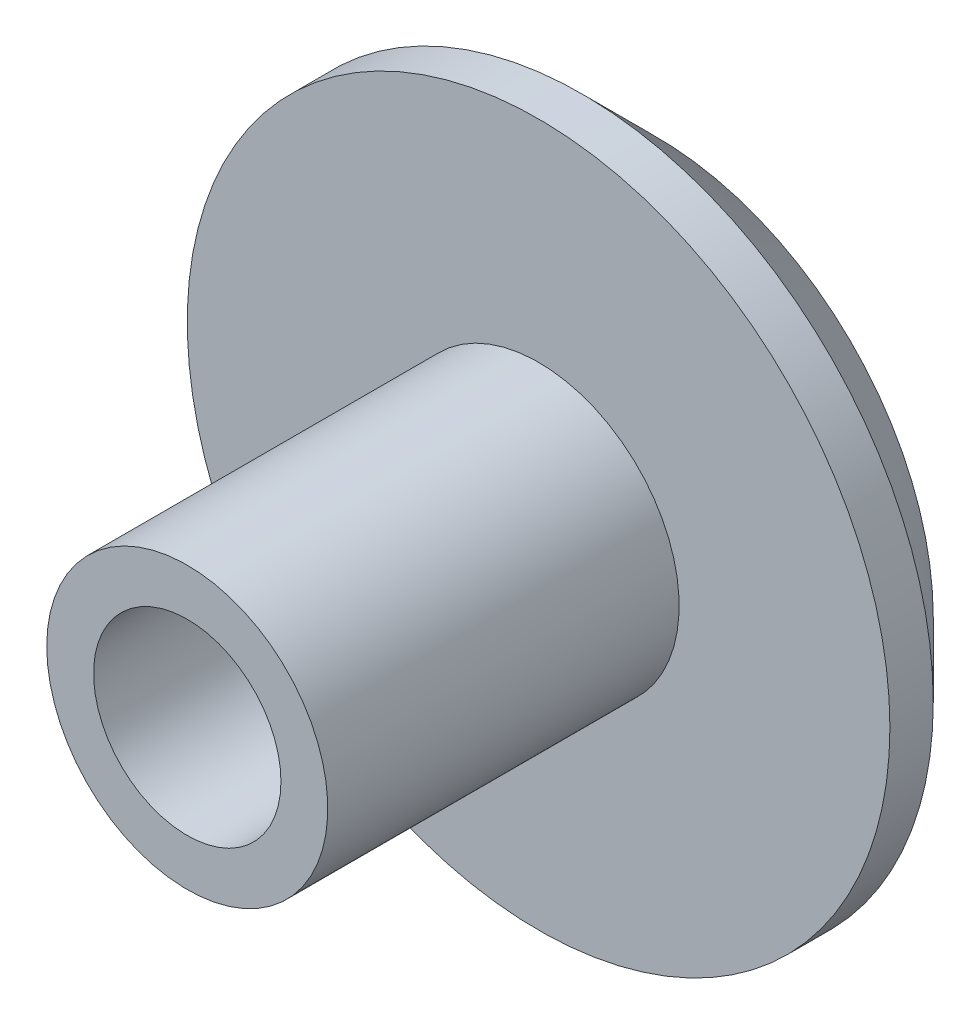
ISO-10303-21;
HEADER;
FILE_DESCRIPTION(('STEP AP214'),'2;1');
FILE_NAME('part.step','',(''),(''),'','','');
FILE_SCHEMA(('AUTOMOTIVE_DESIGN { 1 0 10303 214 1 1 1 1 }'));
ENDSEC;
DATA;
#1=APPLICATION_CONTEXT('core data for automotive mechanical design processes');
#2=APPLICATION_PROTOCOL_DEFINITION('international standard','automotive_design',2000,#1);
#3=PRODUCT_CONTEXT('',#1,'mechanical');
#4=PRODUCT('Part','Part','',(#3));
#5=PRODUCT_RELATED_PRODUCT_CATEGORY('part','',(#4));
#6=PRODUCT_DEFINITION_FORMATION('','',#4);
#7=PRODUCT_DEFINITION_CONTEXT('part definition',#1,'design');
#8=PRODUCT_DEFINITION('design','',#6,#7);
#9=PRODUCT_DEFINITION_SHAPE('','',#8);
#10=(LENGTH_UNIT() NAMED_UNIT(*) SI_UNIT(.MILLI.,.METRE.));
#11=(NAMED_UNIT(*) PLANE_ANGLE_UNIT() SI_UNIT($,.RADIAN.));
#12=(NAMED_UNIT(*) SI_UNIT($,.STERADIAN.) SOLID_ANGLE_UNIT());
#13=UNCERTAINTY_MEASURE_WITH_UNIT(LENGTH_MEASURE(1.E-05),#10,'distance_accuracy_value','');
#14=(GEOMETRIC_REPRESENTATION_CONTEXT(3) GLOBAL_UNCERTAINTY_ASSIGNED_CONTEXT((#13)) GLOBAL_UNIT_ASSIGNED_CONTEXT((#10,
#11,#12)) REPRESENTATION_CONTEXT('',''));
#15=CARTESIAN_POINT('',(0.,0.,0.));
#16=DIRECTION('',(0.,0.,1.));
#17=DIRECTION('',(1.,0.,0.));
#18=AXIS2_PLACEMENT_3D('',#15,#16,#17);
#19=CARTESIAN_POINT('',(0.,0.,1.5875));
#20=DIRECTION('',(0.,0.,-1.));
#21=DIRECTION('',(-1.,0.,0.));
#22=AXIS2_PLACEMENT_3D('',#19,#20,#21);
#23=CYLINDRICAL_SURFACE('',#22,4.7625);
#24=CARTESIAN_POINT('',(0.,0.,0.999999999999999));
#25=DIRECTION('',(0.,0.,1.));
#26=DIRECTION('',(1.,0.,0.));
#27=AXIS2_PLACEMENT_3D('',#24,#25,#26);
#28=CIRCLE('',#27,4.7625);
#29=CARTESIAN_POINT('',(4.7625,0.,0.999999999999999));
#30=VERTEX_POINT('',#29);
#31=EDGE_CURVE('E45',#30,#30,#28,.T.);
#32=ORIENTED_EDGE('',*,*,#31,.T.);
#33=EDGE_LOOP('',(#32));
#34=FACE_BOUND('',#33,.T.);
#35=CARTESIAN_POINT('',(0.,0.,1.5875));
#36=DIRECTION('',(0.,0.,1.));
#37=DIRECTION('',(1.,0.,0.));
#38=AXIS2_PLACEMENT_3D('',#35,#36,#37);
#39=CIRCLE('',#38,4.7625);
#40=CARTESIAN_POINT('',(4.7625,0.,1.5875));
#41=VERTEX_POINT('',#40);
#42=EDGE_CURVE('E53',#41,#41,#39,.T.);
#43=ORIENTED_EDGE('',*,*,#42,.F.);
#44=EDGE_LOOP('',(#43));
#45=FACE_BOUND('',#44,.T.);
#46=ADVANCED_FACE('F37',(#34,#45),#23,.T.);
#47=CARTESIAN_POINT('',(0.,0.,1.5875));
#48=DIRECTION('',(0.,0.,1.));
#49=DIRECTION('',(1.,0.,0.));
#50=AXIS2_PLACEMENT_3D('',#47,#48,#49);
#51=PLANE('',#50);
#52=CARTESIAN_POINT('',(0.,0.,1.5875));
#53=DIRECTION('',(0.,0.,1.));
#54=DIRECTION('',(1.,0.,0.));
#55=AXIS2_PLACEMENT_3D('',#52,#53,#54);
#56=CIRCLE('',#55,1.905);
#57=CARTESIAN_POINT('',(-1.905,0.,1.5875));
#58=VERTEX_POINT('',#57);
#59=EDGE_CURVE('E49',#58,#58,#56,.T.);
#60=ORIENTED_EDGE('',*,*,#59,.F.);
#61=EDGE_LOOP('',(#60));
#62=FACE_BOUND('',#61,.T.);
#63=ORIENTED_EDGE('',*,*,#42,.T.);
#64=EDGE_LOOP('',(#63));
#65=FACE_BOUND('',#64,.T.);
#66=ADVANCED_FACE('F88',(#62,#65),#51,.T.);
#67=CARTESIAN_POINT('',(0.,0.,0.));
#68=DIRECTION('',(0.,0.,1.));
#69=DIRECTION('',(1.,0.,0.));
#70=AXIS2_PLACEMENT_3D('',#67,#68,#69);
#71=PLANE('',#70);
#72=CARTESIAN_POINT('',(0.,0.,0.));
#73=DIRECTION('',(0.,0.,1.));
#74=DIRECTION('',(1.,0.,0.));
#75=AXIS2_PLACEMENT_3D('',#72,#73,#74);
#76=CIRCLE('',#75,3.7625);
#77=CARTESIAN_POINT('',(3.7625,0.,0.));
#78=VERTEX_POINT('',#77);
#79=EDGE_CURVE('E10',#78,#78,#76,.F.);
#80=ORIENTED_EDGE('',*,*,#79,.T.);
#81=EDGE_LOOP('',(#80));
#82=FACE_BOUND('',#81,.T.);
#83=CARTESIAN_POINT('',(0.,0.,0.));
#84=DIRECTION('',(0.,0.,1.));
#85=DIRECTION('',(1.,0.,0.));
#86=AXIS2_PLACEMENT_3D('',#83,#84,#85);
#87=CIRCLE('',#86,1.27);
#88=CARTESIAN_POINT('',(1.27,0.,0.));
#89=VERTEX_POINT('',#88);
#90=EDGE_CURVE('E61',#89,#89,#87,.T.);
#91=ORIENTED_EDGE('',*,*,#90,.T.);
#92=EDGE_LOOP('',(#91));
#93=FACE_BOUND('',#92,.T.);
#94=ADVANCED_FACE('F68',(#82,#93),#71,.F.);
#95=CARTESIAN_POINT('',(0.,0.,6.35));
#96=DIRECTION('',(0.,0.,-1.));
#97=DIRECTION('',(-1.,0.,0.));
#98=AXIS2_PLACEMENT_3D('',#95,#96,#97);
#99=CYLINDRICAL_SURFACE('',#98,1.905);
#100=CARTESIAN_POINT('',(0.,0.,6.35));
#101=DIRECTION('',(0.,0.,1.));
#102=DIRECTION('',(1.,0.,0.));
#103=AXIS2_PLACEMENT_3D('',#100,#101,#102);
#104=CIRCLE('',#103,1.905);
#105=CARTESIAN_POINT('',(-1.905,0.,6.35));
#106=VERTEX_POINT('',#105);
#107=EDGE_CURVE('E57',#106,#106,#104,.T.);
#108=CARTESIAN_POINT('',(-1.905,0.,6.35));
#109=CARTESIAN_POINT('',(-1.905,0.,6.300390625));
#110=CARTESIAN_POINT('',(-1.905,0.,6.25078125));
#111=CARTESIAN_POINT('',(-1.905,0.,6.1515625));
#112=CARTESIAN_POINT('',(-1.905,0.,6.101953125));
#113=CARTESIAN_POINT('',(-1.905,0.,6.002734375));
#114=CARTESIAN_POINT('',(-1.905,0.,5.953125));
#115=CARTESIAN_POINT('',(-1.905,0.,5.85390625));
#116=CARTESIAN_POINT('',(-1.905,0.,5.804296875));
#117=CARTESIAN_POINT('',(-1.905,0.,5.705078125));
#118=CARTESIAN_POINT('',(-1.905,0.,5.65546875));
#119=CARTESIAN_POINT('',(-1.905,0.,5.55625));
#120=CARTESIAN_POINT('',(-1.905,0.,5.506640625));
#121=CARTESIAN_POINT('',(-1.905,0.,5.407421875));
#122=CARTESIAN_POINT('',(-1.905,0.,5.3578125));
#123=CARTESIAN_POINT('',(-1.905,0.,5.25859375));
#124=CARTESIAN_POINT('',(-1.905,0.,5.208984375));
#125=CARTESIAN_POINT('',(-1.905,0.,5.109765625));
#126=CARTESIAN_POINT('',(-1.905,0.,5.06015625));
#127=CARTESIAN_POINT('',(-1.905,0.,4.9609375));
#128=CARTESIAN_POINT('',(-1.905,0.,4.911328125));
#129=CARTESIAN_POINT('',(-1.905,0.,4.812109375));
#130=CARTESIAN_POINT('',(-1.905,0.,4.7625));
#131=CARTESIAN_POINT('',(-1.905,0.,4.66328125));
#132=CARTESIAN_POINT('',(-1.905,0.,4.613671875));
#133=CARTESIAN_POINT('',(-1.905,0.,4.514453125));
#134=CARTESIAN_POINT('',(-1.905,0.,4.46484375));
#135=CARTESIAN_POINT('',(-1.905,0.,4.365625));
#136=CARTESIAN_POINT('',(-1.905,0.,4.316015625));
#137=CARTESIAN_POINT('',(-1.905,0.,4.216796875));
#138=CARTESIAN_POINT('',(-1.905,0.,4.1671875));
#139=CARTESIAN_POINT('',(-1.905,0.,4.06796875));
#140=CARTESIAN_POINT('',(-1.905,0.,4.018359375));
#141=CARTESIAN_POINT('',(-1.905,0.,3.919140625));
#142=CARTESIAN_POINT('',(-1.905,0.,3.86953125));
#143=CARTESIAN_POINT('',(-1.905,0.,3.7703125));
#144=CARTESIAN_POINT('',(-1.905,0.,3.720703125));
#145=CARTESIAN_POINT('',(-1.905,0.,3.621484375));
#146=CARTESIAN_POINT('',(-1.905,0.,3.571875));
#147=CARTESIAN_POINT('',(-1.905,0.,3.47265625));
#148=CARTESIAN_POINT('',(-1.905,0.,3.423046875));
#149=CARTESIAN_POINT('',(-1.905,0.,3.323828125));
#150=CARTESIAN_POINT('',(-1.905,0.,3.27421875));
#151=CARTESIAN_POINT('',(-1.905,0.,3.175));
#152=CARTESIAN_POINT('',(-1.905,0.,3.125390625));
#153=CARTESIAN_POINT('',(-1.905,0.,3.026171875));
#154=CARTESIAN_POINT('',(-1.905,0.,2.9765625));
#155=CARTESIAN_POINT('',(-1.905,0.,2.87734375));
#156=CARTESIAN_POINT('',(-1.905,0.,2.827734375));
#157=CARTESIAN_POINT('',(-1.905,0.,2.728515625));
#158=CARTESIAN_POINT('',(-1.905,0.,2.67890625));
#159=CARTESIAN_POINT('',(-1.905,0.,2.5796875));
#160=CARTESIAN_POINT('',(-1.905,0.,2.530078125));
#161=CARTESIAN_POINT('',(-1.905,0.,2.430859375));
#162=CARTESIAN_POINT('',(-1.905,0.,2.38125));
#163=CARTESIAN_POINT('',(-1.905,0.,2.28203125));
#164=CARTESIAN_POINT('',(-1.905,0.,2.232421875));
#165=CARTESIAN_POINT('',(-1.905,0.,2.133203125));
#166=CARTESIAN_POINT('',(-1.905,0.,2.08359375));
#167=CARTESIAN_POINT('',(-1.905,0.,1.984375));
#168=CARTESIAN_POINT('',(-1.905,0.,1.934765625));
#169=CARTESIAN_POINT('',(-1.905,0.,1.835546875));
#170=CARTESIAN_POINT('',(-1.905,0.,1.7859375));
#171=CARTESIAN_POINT('',(-1.905,0.,1.68671875));
#172=CARTESIAN_POINT('',(-1.905,0.,1.637109375));
#173=CARTESIAN_POINT('',(-1.905,0.,1.5875));
#174=B_SPLINE_CURVE_WITH_KNOTS('',3,(#108,#109,#110,#111,#112,#113,#114,#115,#116,#117,#118,
#119,#120,#121,#122,#123,#124,#125,#126,#127,#128,#129,#130,#131,#132,#133,#134,#135,#136,#137,
#138,#139,#140,#141,#142,#143,#144,#145,#146,#147,#148,#149,#150,#151,#152,#153,#154,#155,#156,
#157,#158,#159,#160,#161,#162,#163,#164,#165,#166,#167,#168,#169,#170,#171,#172,#173),
.UNSPECIFIED.,.F.,.F.,(4,2,2,2,2,2,2,2,2,2,2,2,2,2,2,2,2,2,2,2,2,2,2,2,2,2,2,2,2,2,2,2,4),(0.,
0.148828124999999,0.297656249999999,0.446484374999999,0.595312499999999,0.744140625,0.89296875,
1.041796875,1.190625,1.339453125,1.48828125,1.637109375,1.7859375,1.934765625,2.08359375,
2.232421875,2.38125,2.530078125,2.67890625,2.827734375,2.9765625,3.125390625,3.27421875,
3.423046875,3.571875,3.720703125,3.86953125,4.018359375,4.1671875,4.316015625,4.46484375,
4.613671875,4.7625),.UNSPECIFIED.);
#175=EDGE_CURVE('BSEAM79',#106,#58,#174,.T.);
#176=ORIENTED_EDGE('',*,*,#107,.F.);
#177=ORIENTED_EDGE('',*,*,#59,.T.);
#178=ORIENTED_EDGE('',*,*,#175,.T.);
#179=ORIENTED_EDGE('',*,*,#175,.F.);
#180=EDGE_LOOP('',(#176,#178,#177,#179));
#181=FACE_BOUND('',#180,.T.);
#182=ADVANCED_FACE('F79',(#181),#99,.T.);
#183=CARTESIAN_POINT('',(0.,0.,6.35));
#184=DIRECTION('',(0.,0.,1.));
#185=DIRECTION('',(1.,0.,0.));
#186=AXIS2_PLACEMENT_3D('',#183,#184,#185);
#187=PLANE('',#186);
#188=CARTESIAN_POINT('',(0.,0.,6.35));
#189=DIRECTION('',(0.,0.,1.));
#190=DIRECTION('',(1.,0.,0.));
#191=AXIS2_PLACEMENT_3D('',#188,#189,#190);
#192=CIRCLE('',#191,1.27);
#193=CARTESIAN_POINT('',(1.27,0.,6.35));
#194=VERTEX_POINT('',#193);
#195=EDGE_CURVE('E62',#194,#194,#192,.T.);
#196=ORIENTED_EDGE('',*,*,#195,.F.);
#197=EDGE_LOOP('',(#196));
#198=FACE_BOUND('',#197,.T.);
#199=ORIENTED_EDGE('',*,*,#107,.T.);
#200=EDGE_LOOP('',(#199));
#201=FACE_BOUND('',#200,.T.);
#202=ADVANCED_FACE('F73',(#198,#201),#187,.T.);
#203=CARTESIAN_POINT('',(0.,0.,0.));
#204=DIRECTION('',(0.,0.,1.));
#205=DIRECTION('',(1.,0.,0.));
#206=AXIS2_PLACEMENT_3D('',#203,#204,#205);
#207=CYLINDRICAL_SURFACE('',#206,1.27);
#208=ORIENTED_EDGE('',*,*,#90,.F.);
#209=EDGE_LOOP('',(#208));
#210=FACE_BOUND('',#209,.T.);
#211=ORIENTED_EDGE('',*,*,#195,.T.);
#212=EDGE_LOOP('',(#211));
#213=FACE_BOUND('',#212,.T.);
#214=ADVANCED_FACE('F70',(#210,#213),#207,.F.);
#215=CARTESIAN_POINT('',(0.,0.,0.999999999999999));
#216=DIRECTION('',(0.,0.,1.));
#217=DIRECTION('',(1.,0.,0.));
#218=AXIS2_PLACEMENT_3D('',#215,#216,#217);
#219=CONICAL_SURFACE('',#218,4.7625,0.78539816339745);
#220=ORIENTED_EDGE('',*,*,#79,.F.);
#221=EDGE_LOOP('',(#220));
#222=FACE_BOUND('',#221,.T.);
#223=ORIENTED_EDGE('',*,*,#31,.F.);
#224=EDGE_LOOP('',(#223));
#225=FACE_BOUND('',#224,.T.);
#226=ADVANCED_FACE('F40',(#222,#225),#219,.T.);
#227=CLOSED_SHELL('',(#46,#66,#94,#182,#202,#214,#226));
#228=MANIFOLD_SOLID_BREP('B2',#227);
#229=ADVANCED_BREP_SHAPE_REPRESENTATION('',(#18,#228),#14);
#230=SHAPE_DEFINITION_REPRESENTATION(#9,#229);
ENDSEC;
END-ISO-10303-21;
